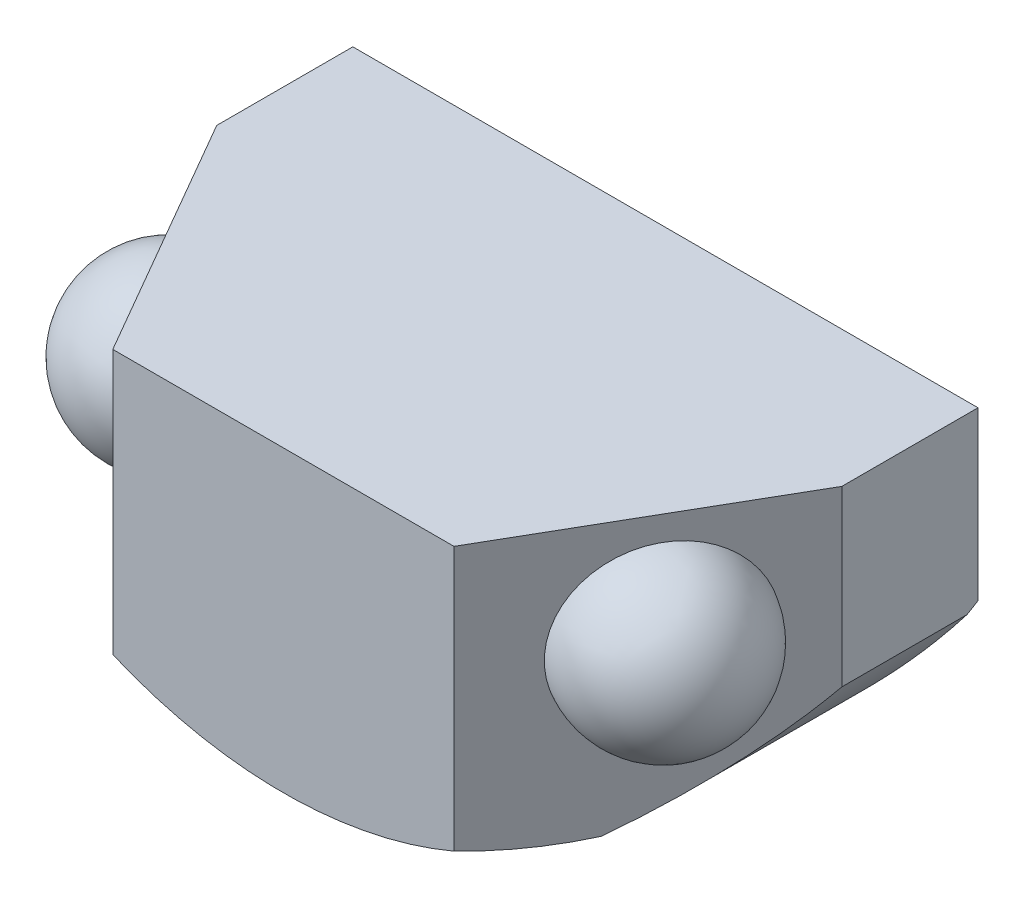
ISO-10303-21;
HEADER;
FILE_DESCRIPTION(('STEP AP214'),'2;1');
FILE_NAME('part.step','',(''),(''),'','','');
FILE_SCHEMA(('AUTOMOTIVE_DESIGN { 1 0 10303 214 1 1 1 1 }'));
ENDSEC;
DATA;
#1=APPLICATION_CONTEXT('core data for automotive mechanical design processes');
#2=APPLICATION_PROTOCOL_DEFINITION('international standard','automotive_design',2000,#1);
#3=PRODUCT_CONTEXT('',#1,'mechanical');
#4=PRODUCT('Part','Part','',(#3));
#5=PRODUCT_RELATED_PRODUCT_CATEGORY('part','',(#4));
#6=PRODUCT_DEFINITION_FORMATION('','',#4);
#7=PRODUCT_DEFINITION_CONTEXT('part definition',#1,'design');
#8=PRODUCT_DEFINITION('design','',#6,#7);
#9=PRODUCT_DEFINITION_SHAPE('','',#8);
#10=(LENGTH_UNIT() NAMED_UNIT(*) SI_UNIT(.MILLI.,.METRE.));
#11=(NAMED_UNIT(*) PLANE_ANGLE_UNIT() SI_UNIT($,.RADIAN.));
#12=(NAMED_UNIT(*) SI_UNIT($,.STERADIAN.) SOLID_ANGLE_UNIT());
#13=UNCERTAINTY_MEASURE_WITH_UNIT(LENGTH_MEASURE(1.E-05),#10,'distance_accuracy_value','');
#14=(GEOMETRIC_REPRESENTATION_CONTEXT(3) GLOBAL_UNCERTAINTY_ASSIGNED_CONTEXT((#13)) GLOBAL_UNIT_ASSIGNED_CONTEXT((#10,
#11,#12)) REPRESENTATION_CONTEXT('',''));
#15=CARTESIAN_POINT('',(0.,0.,0.));
#16=DIRECTION('',(0.,0.,1.));
#17=DIRECTION('',(1.,0.,0.));
#18=AXIS2_PLACEMENT_3D('',#15,#16,#17);
#19=CARTESIAN_POINT('',(-0.110419645241125,89.9999564553573,0.));
#20=DIRECTION('',(-1.,0.,0.));
#21=DIRECTION('',(0.,1.,0.));
#22=AXIS2_PLACEMENT_3D('',#19,#20,#21);
#23=SPHERICAL_SURFACE('',#22,137.5);
#24=CARTESIAN_POINT('',(-90.,89.9999564553573,0.));
#25=DIRECTION('',(1.,0.,0.));
#26=DIRECTION('',(0.,0.,-1.));
#27=AXIS2_PLACEMENT_3D('',#24,#25,#26);
#28=CIRCLE('',#27,104.048610483972);
#29=CARTESIAN_POINT('',(-90.,1.67604494977834,-55.));
#30=VERTEX_POINT('',#29);
#31=CARTESIAN_POINT('',(-90.,0.,-52.2122704129895));
#32=VERTEX_POINT('',#31);
#33=EDGE_CURVE('E136',#30,#32,#28,.F.);
#34=ORIENTED_EDGE('',*,*,#33,.F.);
#35=CARTESIAN_POINT('',(-0.110419645241125,89.9999564553573,-55.));
#36=DIRECTION('',(0.,0.,1.));
#37=DIRECTION('',(1.,0.,0.));
#38=AXIS2_PLACEMENT_3D('',#35,#36,#37);
#39=CIRCLE('',#38,126.020831611286);
#40=CARTESIAN_POINT('',(90.,1.90136241800312,-55.));
#41=VERTEX_POINT('',#40);
#42=EDGE_CURVE('E230',#41,#30,#39,.F.);
#43=ORIENTED_EDGE('',*,*,#42,.F.);
#44=CARTESIAN_POINT('',(90.,89.9999564553573,0.));
#45=DIRECTION('',(-1.,0.,0.));
#46=DIRECTION('',(0.,0.,1.));
#47=AXIS2_PLACEMENT_3D('',#44,#45,#46);
#48=CIRCLE('',#47,103.857413174788);
#49=CARTESIAN_POINT('',(89.9999999999999,0.,-51.8302046049629));
#50=VERTEX_POINT('',#49);
#51=EDGE_CURVE('E114',#50,#41,#48,.F.);
#52=ORIENTED_EDGE('',*,*,#51,.F.);
#53=CARTESIAN_POINT('',(90.0001244441362,0.000200000000027756,51.8303355371423));
#54=CARTESIAN_POINT('',(89.5643371455507,-0.700178610352941,51.3718230897122));
#55=CARTESIAN_POINT('',(89.1209950129852,-1.39446653913515,50.9112431579466));
#56=CARTESIAN_POINT('',(88.2196176610746,-2.77053290730016,49.985812461782));
#57=CARTESIAN_POINT('',(87.7615825901859,-3.45231147296736,49.5209617405685));
#58=CARTESIAN_POINT('',(86.3661085050789,-5.4783261612274,48.119845001896));
#59=CARTESIAN_POINT('',(85.4072451328863,-6.80333036203356,47.1769561764502));
#60=CARTESIAN_POINT('',(83.4354444766202,-9.40020378230806,45.2715730827207));
#61=CARTESIAN_POINT('',(82.4224621713083,-10.6720271424476,44.3090629164704));
#62=CARTESIAN_POINT('',(80.8662611778364,-12.5368772423552,42.8499369600321));
#63=CARTESIAN_POINT('',(80.3414035632126,-13.1513493935201,42.3609990602982));
#64=CARTESIAN_POINT('',(79.2799772964037,-14.3657275987914,41.3776632115938));
#65=CARTESIAN_POINT('',(78.7434079006048,-14.9656327228578,40.8832649169179));
#66=CARTESIAN_POINT('',(77.1258395645888,-16.7333616653512,39.3994887038453));
#67=CARTESIAN_POINT('',(76.0285411442321,-17.8792962955489,38.4016452998256));
#68=CARTESIAN_POINT('',(73.795832544943,-20.1095601196962,36.3802409435415));
#69=CARTESIAN_POINT('',(72.6604226830874,-21.1938898259799,35.3566802052561));
#70=CARTESIAN_POINT('',(70.3587431820081,-23.2973821302197,33.2801090758536));
#71=CARTESIAN_POINT('',(69.1924974784448,-24.3165932904109,32.2271214925139));
#72=CARTESIAN_POINT('',(67.425770121288,-25.7945945362514,30.6204424481673));
#73=CARTESIAN_POINT('',(66.8340001076856,-26.2787677369068,30.0803795487446));
#74=CARTESIAN_POINT('',(65.6459073343606,-27.2297641403249,28.9900701648321));
#75=CARTESIAN_POINT('',(65.0495846227699,-27.6965875262075,28.4398237879166));
#76=CARTESIAN_POINT('',(63.7462840446876,-28.6947499299435,27.2278883856204));
#77=CARTESIAN_POINT('',(63.038699971346,-29.2225857774781,26.5639600575375));
#78=CARTESIAN_POINT('',(61.6222421511666,-30.2523380718784,25.2177281136735));
#79=CARTESIAN_POINT('',(60.9133684974253,-30.7542563184587,24.5354257788002));
#80=CARTESIAN_POINT('',(59.4958499101807,-31.732477069737,23.147019187393));
#81=CARTESIAN_POINT('',(58.7872124973898,-32.2086953459053,22.4408477043511));
#82=CARTESIAN_POINT('',(57.3774265274438,-33.132153418792,21.0025764090854));
#83=CARTESIAN_POINT('',(56.6762774853064,-33.5793951017937,20.2704782894107));
#84=CARTESIAN_POINT('',(55.2828275915951,-34.4460442770492,18.7690500720258));
#85=CARTESIAN_POINT('',(54.5906378104413,-34.8652085147239,17.9994748943805));
#86=CARTESIAN_POINT('',(53.2303358814403,-35.6687270494109,16.4208304088638));
#87=CARTESIAN_POINT('',(52.5622362009678,-36.0530634733196,15.6117411470586));
#88=CARTESIAN_POINT('',(51.2672518893754,-36.7804762913613,13.9479375177054));
#89=CARTESIAN_POINT('',(50.640227638782,-37.1236961389575,13.0933977504839));
#90=CARTESIAN_POINT('',(49.7461406001163,-37.6025462900454,11.7679250196526));
#91=CARTESIAN_POINT('',(49.4559712358348,-37.7561064245375,11.3190317887242));
#92=CARTESIAN_POINT('',(48.8949655120424,-38.0498925238791,10.4051581079762));
#93=CARTESIAN_POINT('',(48.6241241452361,-38.1901219454598,9.9401818714591));
#94=CARTESIAN_POINT('',(48.1323973181046,-38.4422623005999,9.04030020414074));
#95=CARTESIAN_POINT('',(47.9092260379225,-38.5556028608424,8.60705737083245));
#96=CARTESIAN_POINT('',(47.4865000908309,-38.7686043510765,7.72602625182977));
#97=CARTESIAN_POINT('',(47.2869458045778,-38.8682650605818,7.27823773183771));
#98=CARTESIAN_POINT('',(46.7314483084643,-39.1437972326752,5.9139244899931));
#99=CARTESIAN_POINT('',(46.4174844045664,-39.2968203601745,4.97436864754291));
#100=CARTESIAN_POINT('',(45.9804192402713,-39.5083900742484,3.19258080251376));
#101=CARTESIAN_POINT('',(45.8356619768001,-39.5777107416758,2.35706491631263));
#102=CARTESIAN_POINT('',(45.677848982549,-39.6532420632213,0.670681118657874));
#103=CARTESIAN_POINT('',(45.6647089317822,-39.6594931226244,-0.180176613996959));
#104=CARTESIAN_POINT('',(45.7719734967884,-39.6082069943576,-1.87007872066989));
#105=CARTESIAN_POINT('',(45.8922334084327,-39.5507389253349,-2.70913489736391));
#106=CARTESIAN_POINT('',(46.2489589681337,-39.3785691041607,-4.35582446157462));
#107=CARTESIAN_POINT('',(46.4855269500442,-39.2638169491404,-5.16342950020558));
#108=CARTESIAN_POINT('',(46.9970603177986,-39.012322917215,-6.5912525034693));
#109=CARTESIAN_POINT('',(47.2568699345828,-38.8835538636362,-7.21853591003946));
#110=CARTESIAN_POINT('',(47.8237014513651,-38.5991233002087,-8.44533755796082));
#111=CARTESIAN_POINT('',(48.1307569023889,-38.4434426696711,-9.04483567116382));
#112=CARTESIAN_POINT('',(48.7821371892332,-38.1086481711404,-10.2193076686139));
#113=CARTESIAN_POINT('',(49.1266008427314,-37.9294464680038,-10.7941783471244));
#114=CARTESIAN_POINT('',(49.8429859143022,-37.5512749329174,-11.9193610561673));
#115=CARTESIAN_POINT('',(50.2149001260322,-37.352310284443,-12.4696794717415));
#116=CARTESIAN_POINT('',(51.1625991755198,-36.837499685889,-13.8071620348821));
#117=CARTESIAN_POINT('',(51.7507317469119,-36.5113056296251,-14.5815593519037));
#118=CARTESIAN_POINT('',(52.9569778147217,-35.8261446064475,-16.09179711075));
#119=CARTESIAN_POINT('',(53.5751074833687,-35.4671598671027,-16.8276162992383));
#120=CARTESIAN_POINT('',(54.8318125068668,-34.7193920532727,-18.2685762653042));
#121=CARTESIAN_POINT('',(55.4704245429064,-34.3305535544394,-18.9736559757949));
#122=CARTESIAN_POINT('',(56.7593760194481,-33.5262557848294,-20.3569788055743));
#123=CARTESIAN_POINT('',(57.4097131728228,-33.1108016662356,-21.0352270779526));
#124=CARTESIAN_POINT('',(58.7215745668974,-32.2518890038446,-22.3741653990402));
#125=CARTESIAN_POINT('',(59.3831456960689,-31.8082496946928,-23.0346930349095));
#126=CARTESIAN_POINT('',(60.7087325864702,-30.8970472216399,-24.3365124925444));
#127=CARTESIAN_POINT('',(61.3727484230845,-30.4294833141737,-24.9778037154676));
#128=CARTESIAN_POINT('',(62.6993637677329,-29.4719738557513,-26.243235385654));
#129=CARTESIAN_POINT('',(63.3619640272427,-28.9820509468545,-26.8673922013515));
#130=CARTESIAN_POINT('',(64.6839094101512,-27.9802356608434,-28.1013844400579));
#131=CARTESIAN_POINT('',(65.3432543938911,-27.4683423501255,-28.7112192527647));
#132=CARTESIAN_POINT('',(67.1419632419827,-26.0370975087309,-30.3644616243266));
#133=CARTESIAN_POINT('',(68.2759327390024,-25.0962226432387,-31.3951921628885));
#134=CARTESIAN_POINT('',(70.5191280089368,-23.1533674099443,-33.425668162579));
#135=CARTESIAN_POINT('',(71.6283513804514,-22.1513811467278,-34.4254106202128));
#136=CARTESIAN_POINT('',(73.816233265414,-20.0882791176858,-36.3994182606151));
#137=CARTESIAN_POINT('',(74.8948684013443,-19.0271198725165,-37.3736639154216));
#138=CARTESIAN_POINT('',(77.0152957211372,-16.848848548111,-39.2994191075076));
#139=CARTESIAN_POINT('',(78.0570879346813,-15.7317365139531,-40.2509286631037));
#140=CARTESIAN_POINT('',(80.0774562355747,-13.4683591186317,-42.1136901339994));
#141=CARTESIAN_POINT('',(81.0569069454593,-12.3232246910942,-43.0253678337385));
#142=CARTESIAN_POINT('',(82.9723809015412,-9.98385899570126,-44.8311906195868));
#143=CARTESIAN_POINT('',(83.9084041968393,-8.78962778335959,-45.7253357255184));
#144=CARTESIAN_POINT('',(85.7329372372583,-6.35523164362213,-47.4967506659377));
#145=CARTESIAN_POINT('',(86.6214830997474,-5.11510288336522,-48.3740329934772));
#146=CARTESIAN_POINT('',(88.3488527003866,-2.59029210823437,-50.1133751139867));
#147=CARTESIAN_POINT('',(89.187675360651,-1.30560912848264,-50.9754345766755));
#148=CARTESIAN_POINT('',(90.0001244441362,0.000200000000022882,-51.8303355371423));
#149=B_SPLINE_CURVE_WITH_KNOTS('',3,(#53,#54,#55,#56,#57,#58,#59,#60,#61,#62,#63,#64,#65,#66,
#67,#68,#69,#70,#71,#72,#73,#74,#75,#76,#77,#78,#79,#80,#81,#82,#83,#84,#85,#86,#87,#88,#89,#90,
#91,#92,#93,#94,#95,#96,#97,#98,#99,#100,#101,#102,#103,#104,#105,#106,#107,#108,#109,#110,#111,
#112,#113,#114,#115,#116,#117,#118,#119,#120,#121,#122,#123,#124,#125,#126,#127,#128,#129,#130,
#131,#132,#133,#134,#135,#136,#137,#138,#139,#140,#141,#142,#143,#144,#145,#146,#147,#148),
.UNSPECIFIED.,.F.,.F.,(4,2,2,2,2,2,2,2,2,2,2,2,2,2,2,2,2,2,2,2,2,2,2,2,2,2,2,2,2,2,2,2,2,2,2,2,
2,2,2,2,2,2,2,2,2,2,2,4),(0.,2.83116123108852,5.66229386532291,11.3241993444443,
16.9908905839125,19.8242643091421,22.657818459564,28.2789397297367,33.9000142452987,
39.5168466932012,42.3249613881043,45.1330464361406,48.4463400706982,51.7594033203657,
55.0827366388699,58.4058534011994,61.7547890266959,65.1054336556731,68.4440248114548,
70.1118456283679,71.7792327832148,73.2793547200334,74.779500832372,77.7724328596681,
80.3136055360611,82.8531501171807,85.3899426469948,87.9289711832449,89.9991730301529,
92.0708518479042,94.1504996184289,96.2296033667748,99.3042420254029,102.380557128708,
105.462728423153,108.544304871179,111.648162567152,114.752116788221,117.852994635762,
120.954004381803,126.346949881976,131.740416464835,137.137899682296,142.535378551344,
147.817670042325,153.099955560782,158.378163755363,163.65648632766),.UNSPECIFIED.);
#150=CARTESIAN_POINT('',(64.6616836771224,-27.9932536817081,28.0789421586245));
#151=VERTEX_POINT('',#150);
#152=EDGE_CURVE('E109',#151,#50,#149,.T.);
#153=ORIENTED_EDGE('',*,*,#152,.F.);
#154=CARTESIAN_POINT('',(60.6271964569131,89.9999564553573,35.0668790065144));
#155=DIRECTION('',(0.866025403784442,0.,0.499999999999995));
#156=DIRECTION('',(0.499999999999995,0.,-0.866025403784442));
#157=AXIS2_PLACEMENT_3D('',#154,#155,#156);
#158=CIRCLE('',#157,118.268787036013);
#159=CARTESIAN_POINT('',(49.1188036855349,-26.007515589544,55.));
#160=VERTEX_POINT('',#159);
#161=EDGE_CURVE('E112',#151,#160,#158,.F.);
#162=ORIENTED_EDGE('',*,*,#161,.T.);
#163=CARTESIAN_POINT('',(-0.110419645241125,89.9999564553573,55.));
#164=DIRECTION('',(0.,0.,-1.));
#165=DIRECTION('',(-1.,0.,0.));
#166=AXIS2_PLACEMENT_3D('',#163,#164,#165);
#167=CIRCLE('',#166,126.020831611286);
#168=CARTESIAN_POINT('',(-49.1188036855349,-26.1009836517713,55.));
#169=VERTEX_POINT('',#168);
#170=EDGE_CURVE('E119',#169,#160,#167,.F.);
#171=ORIENTED_EDGE('',*,*,#170,.F.);
#172=CARTESIAN_POINT('',(-60.6824062795336,89.9999564553573,34.9712527886587));
#173=DIRECTION('',(0.866025403784442,0.,-0.499999999999995));
#174=DIRECTION('',(-0.499999999999995,0.,-0.866025403784442));
#175=AXIS2_PLACEMENT_3D('',#172,#173,#174);
#176=CIRCLE('',#175,118.381991508704);
#177=CARTESIAN_POINT('',(-64.4716484701931,-28.1392093113304,28.4080927922529));
#178=VERTEX_POINT('',#177);
#179=EDGE_CURVE('E239',#178,#169,#176,.F.);
#180=ORIENTED_EDGE('',*,*,#179,.F.);
#181=CARTESIAN_POINT('',(-90.0001244441362,0.000200000000013538,-52.2124009134216));
#182=CARTESIAN_POINT('',(-89.5624140176202,-0.703269330484123,-51.753383766432));
#183=CARTESIAN_POINT('',(-89.1170753476434,-1.40060481363441,-51.2922968600302));
#184=CARTESIAN_POINT('',(-88.2115598162281,-2.78267776574401,-50.3658515587344));
#185=CARTESIAN_POINT('',(-87.7513831066432,-3.46741536351835,-49.9004932075895));
#186=CARTESIAN_POINT('',(-86.3492711699605,-5.50216802415227,-48.4978604056645));
#187=CARTESIAN_POINT('',(-85.385696435819,-6.83281559561238,-47.5539678488508));
#188=CARTESIAN_POINT('',(-83.4039576354995,-9.44053580666943,-45.6466780803139));
#189=CARTESIAN_POINT('',(-82.385750784616,-10.7175650182419,-44.6832659605861));
#190=CARTESIAN_POINT('',(-80.8212975207098,-12.5899379752821,-43.2228684136606));
#191=CARTESIAN_POINT('',(-80.2936196019101,-13.2068704200765,-42.7335199410671));
#192=CARTESIAN_POINT('',(-79.2264126385471,-14.4260745249208,-41.7493982386888));
#193=CARTESIAN_POINT('',(-78.6868828400693,-15.0283452471508,-41.2546246648143));
#194=CARTESIAN_POINT('',(-77.0601925129258,-16.8030764111793,-39.7697241065913));
#195=CARTESIAN_POINT('',(-75.9565210539981,-17.9535054357297,-38.7711947428604));
#196=CARTESIAN_POINT('',(-73.7104716255493,-20.1923946160494,-36.7486802874164));
#197=CARTESIAN_POINT('',(-72.5680939460665,-21.2808552360042,-35.7246953864653));
#198=CARTESIAN_POINT('',(-70.2518026438909,-23.3922986261447,-33.6476472784412));
#199=CARTESIAN_POINT('',(-69.0779128562023,-24.4153290094285,-32.5946060329646));
#200=CARTESIAN_POINT('',(-67.2991251066776,-25.8988674631186,-30.9882782353689));
#201=CARTESIAN_POINT('',(-66.7032353030991,-26.3848550182778,-30.4484035738841));
#202=CARTESIAN_POINT('',(-65.5066775893651,-27.339430869385,-29.3586473964299));
#203=CARTESIAN_POINT('',(-64.9060097254966,-27.8080193336369,-28.8087659773341));
#204=CARTESIAN_POINT('',(-63.5875030489239,-28.8141548596355,-27.5928354825306));
#205=CARTESIAN_POINT('',(-62.868971019077,-29.3480009444807,-26.9244693920728));
#206=CARTESIAN_POINT('',(-61.4301733681519,-30.3893645431117,-25.5694497843268));
#207=CARTESIAN_POINT('',(-60.7099078792312,-30.8968840013903,-24.882797623339));
#208=CARTESIAN_POINT('',(-59.2692120879452,-31.885869087775,-23.4859041360025));
#209=CARTESIAN_POINT('',(-58.548787505391,-32.3672538830793,-22.7755994951969));
#210=CARTESIAN_POINT('',(-57.1148927247112,-33.3007316291497,-21.3292093253033));
#211=CARTESIAN_POINT('',(-56.4014220976733,-33.7528263963303,-20.5931253992816));
#212=CARTESIAN_POINT('',(-54.9828900099538,-34.6288108260241,-19.0841720186509));
#213=CARTESIAN_POINT('',(-54.2779293521167,-35.0524679246175,-18.3110713354176));
#214=CARTESIAN_POINT('',(-52.8912944209354,-35.8648835656794,-16.7256163398187));
#215=CARTESIAN_POINT('',(-52.2096317717343,-36.2536248405186,-15.9132429072708));
#216=CARTESIAN_POINT('',(-50.8863832534329,-36.990030121971,-14.2429101765111));
#217=CARTESIAN_POINT('',(-50.2446699247942,-37.3378282983875,-13.3851139336097));
#218=CARTESIAN_POINT('',(-49.3275352159446,-37.8238501812544,-12.0547176764646));
#219=CARTESIAN_POINT('',(-49.0295132082332,-37.9798528487104,-11.6041693519534));
#220=CARTESIAN_POINT('',(-48.452426747615,-38.2786698870207,-10.6869153570691));
#221=CARTESIAN_POINT('',(-48.173357588954,-38.4214875347378,-10.2202137411198));
#222=CARTESIAN_POINT('',(-47.6652532958426,-38.6789131158255,-9.31625597194655));
#223=CARTESIAN_POINT('',(-47.4339997447078,-38.7949140576137,-8.88065638277966));
#224=CARTESIAN_POINT('',(-46.9948682369359,-39.0133810502649,-7.99462756904302));
#225=CARTESIAN_POINT('',(-46.7869907856767,-39.1158468085134,-7.54419802413026));
#226=CARTESIAN_POINT('',(-46.2062448758477,-39.4000418373118,-6.17129414408214));
#227=CARTESIAN_POINT('',(-45.8750671139624,-39.5591681387787,-5.22516197373359));
#228=CARTESIAN_POINT('',(-45.4087046023636,-39.7815600553324,-3.43505792602775));
#229=CARTESIAN_POINT('',(-45.2508404497527,-39.8559892649558,-2.59852101159753));
#230=CARTESIAN_POINT('',(-45.0671566840728,-39.9424971525947,-0.907738676255292));
#231=CARTESIAN_POINT('',(-45.0412341089224,-39.9546244486723,-0.0535075860716561));
#232=CARTESIAN_POINT('',(-45.1252897666976,-39.9151177531663,1.64604516232995));
#233=CARTESIAN_POINT('',(-45.235218469892,-39.8635069997085,2.49136995437973));
#234=CARTESIAN_POINT('',(-45.5748589316549,-39.7024864315881,4.15168690478056));
#235=CARTESIAN_POINT('',(-45.8046790699859,-39.5930243191336,4.96665090213518));
#236=CARTESIAN_POINT('',(-46.3012128757606,-39.3533264425194,6.39115911118408));
#237=CARTESIAN_POINT('',(-46.5506360611503,-39.2319840284568,7.00849750361389));
#238=CARTESIAN_POINT('',(-47.0963421921211,-38.9632931584815,8.21649409617677));
#239=CARTESIAN_POINT('',(-47.3926568123652,-38.8159271160301,8.80713391247434));
#240=CARTESIAN_POINT('',(-48.0224971101665,-38.4984896706543,9.96460553219159));
#241=CARTESIAN_POINT('',(-48.3561579856697,-38.3283353039821,10.531339892191));
#242=CARTESIAN_POINT('',(-49.0511443881337,-37.9688166769946,11.6408481200176));
#243=CARTESIAN_POINT('',(-49.4124631165835,-37.7794571337629,12.1836278246947));
#244=CARTESIAN_POINT('',(-50.3276346034371,-37.2925878094541,13.4934301577986));
#245=CARTESIAN_POINT('',(-50.8934595808481,-36.9854627746518,14.2484803200684));
#246=CARTESIAN_POINT('',(-52.0552895196212,-36.3400752919794,15.721378436693));
#247=CARTESIAN_POINT('',(-52.6513106534403,-36.0017960775192,16.4392060299163));
#248=CARTESIAN_POINT('',(-53.8642066712637,-35.2969888910323,17.8449866625414));
#249=CARTESIAN_POINT('',(-54.4811160880647,-34.9304127156876,18.5328854576436));
#250=CARTESIAN_POINT('',(-55.7276075200202,-34.1718712044824,19.8827472745893));
#251=CARTESIAN_POINT('',(-56.3571909717596,-33.7799029791715,20.5447073309691));
#252=CARTESIAN_POINT('',(-57.6284925868237,-32.969261991775,21.851670228782));
#253=CARTESIAN_POINT('',(-58.2702665198502,-32.5504096324965,22.4965068932051));
#254=CARTESIAN_POINT('',(-59.557244395524,-31.6899877556693,23.767319305453));
#255=CARTESIAN_POINT('',(-60.202448437864,-31.2484175745768,24.3932945015229));
#256=CARTESIAN_POINT('',(-61.4925196250659,-30.3440210532842,25.6284179646806));
#257=CARTESIAN_POINT('',(-62.137386480528,-29.8812159659459,26.2375821193798));
#258=CARTESIAN_POINT('',(-63.4249707891053,-28.9347506090078,27.4418327081434));
#259=CARTESIAN_POINT('',(-64.0676881590773,-28.4510895425174,28.0369186029407));
#260=CARTESIAN_POINT('',(-65.9137462434715,-27.0282628035832,29.7340190867606));
#261=CARTESIAN_POINT('',(-67.1117838980795,-26.063446236672,30.8204143639204));
#262=CARTESIAN_POINT('',(-69.482568585262,-24.0660787427461,32.958161317529));
#263=CARTESIAN_POINT('',(-70.6553125400903,-23.0335196338929,34.0095087377404));
#264=CARTESIAN_POINT('',(-72.968577663827,-20.9029359007166,36.0837711022589));
#265=CARTESIAN_POINT('',(-74.1090706908623,-19.804856553274,37.1066612030919));
#266=CARTESIAN_POINT('',(-76.3504787296994,-17.5468223400419,39.1272913318909));
#267=CARTESIAN_POINT('',(-77.4513937340013,-16.3868674625275,40.1250313550909));
#268=CARTESIAN_POINT('',(-79.0561518110617,-14.6168488899937,41.5931676747234));
#269=CARTESIAN_POINT('',(-79.5771502111526,-14.0292526481309,42.0720615858429));
#270=CARTESIAN_POINT('',(-80.6078712104242,-12.8403225372818,43.0247969342326));
#271=CARTESIAN_POINT('',(-81.117594514388,-12.2389895317556,43.4986386863384));
#272=CARTESIAN_POINT('',(-82.6291205648981,-10.4147755813654,44.9130139636508));
#273=CARTESIAN_POINT('',(-83.6133002548087,-9.17165677752101,45.8464164850638));
#274=CARTESIAN_POINT('',(-85.5298454429008,-6.63521418533481,47.6947925615549));
#275=CARTESIAN_POINT('',(-86.4622565287402,-5.34193632864198,48.6097818636522));
#276=CARTESIAN_POINT('',(-87.8200918508669,-3.36556723287495,49.9698609574579));
#277=CARTESIAN_POINT('',(-88.2659218626821,-2.70067786761452,50.4211690001602));
#278=CARTESIAN_POINT('',(-89.1436030422652,-1.35905017360555,51.3197680058768));
#279=CARTESIAN_POINT('',(-89.5754540559329,-0.682311714362847,51.7670589245683));
#280=CARTESIAN_POINT('',(-90.0001244441362,0.000200000000058823,52.2124009134216));
#281=B_SPLINE_CURVE_WITH_KNOTS('',3,(#181,#182,#183,#184,#185,#186,#187,#188,#189,#190,#191,
#192,#193,#194,#195,#196,#197,#198,#199,#200,#201,#202,#203,#204,#205,#206,#207,#208,#209,#210,
#211,#212,#213,#214,#215,#216,#217,#218,#219,#220,#221,#222,#223,#224,#225,#226,#227,#228,#229,
#230,#231,#232,#233,#234,#235,#236,#237,#238,#239,#240,#241,#242,#243,#244,#245,#246,#247,#248,
#249,#250,#251,#252,#253,#254,#255,#256,#257,#258,#259,#260,#261,#262,#263,#264,#265,#266,#267,
#268,#269,#270,#271,#272,#273,#274,#275,#276,#277,#278,#279,#280),.UNSPECIFIED.,.F.,.F.,(4,2,2,
2,2,2,2,2,2,2,2,2,2,2,2,2,2,2,2,2,2,2,2,2,2,2,2,2,2,2,2,2,2,2,2,2,2,2,2,2,2,2,2,2,2,2,2,2,2,4),
(0.,2.84144334045694,5.68285761061784,11.3653122986075,17.0522840229015,19.8958011138669,
22.7394996116936,28.3811471081061,34.0227523391735,39.6602043758687,42.4786356962904,
45.2970397464991,48.6480101887032,51.9987327737558,55.3592889128861,58.7196364480059,
62.1047628417462,65.4915542372105,68.8669185559852,70.5531680867627,72.2389974006717,
73.757995972935,75.2770273787577,78.307817951505,80.8604057617729,83.4110013259447,
85.9606672481374,88.5126420279933,90.5401179941695,92.5689693910164,94.6054187410434,
96.6413691138917,99.6158658382601,102.591972840957,105.573266477202,108.554899963288,
111.559090857295,114.563369547805,117.564704351873,120.56615393639,126.213769172352,
131.862067778688,137.51515178777,143.168236868079,145.927504984404,148.686600134378,
154.204681583289,159.71782409476,162.474591336988,165.231388958632),.UNSPECIFIED.);
#282=EDGE_CURVE('E223',#32,#178,#281,.T.);
#283=ORIENTED_EDGE('',*,*,#282,.F.);
#284=EDGE_LOOP('',(#34,#43,#52,#153,#162,#171,#180,#283));
#285=FACE_BOUND('',#284,.T.);
#286=ADVANCED_FACE('F45',(#285),#23,.T.);
#287=CARTESIAN_POINT('',(71.1373818974067,17.9425764885766,16.8627038266085));
#288=DIRECTION('',(0.,1.,0.));
#289=DIRECTION('',(0.499999999999995,0.,-0.866025403784442));
#290=AXIS2_PLACEMENT_3D('',#287,#288,#289);
#291=SPHERICAL_SURFACE('',#290,25.);
#292=CARTESIAN_POINT('',(71.1373818974067,17.9425764885766,16.8627038266085));
#293=DIRECTION('',(0.866025403784442,0.,0.499999999999995));
#294=DIRECTION('',(0.499999999999995,0.,-0.866025403784442));
#295=AXIS2_PLACEMENT_3D('',#292,#293,#294);
#296=SPHERICAL_SURFACE('',#295,25.);
#297=CARTESIAN_POINT('',(71.1373818974067,17.9425764885766,16.8627038266085));
#298=DIRECTION('',(0.866025403784442,0.,0.499999999999995));
#299=DIRECTION('',(0.499999999999995,0.,-0.866025403784442));
#300=AXIS2_PLACEMENT_3D('',#297,#298,#299);
#301=CIRCLE('',#300,25.);
#302=CARTESIAN_POINT('',(83.6373818974066,17.9425764885766,-4.78793126800255));
#303=VERTEX_POINT('',#302);
#304=EDGE_CURVE('E130',#303,#303,#301,.T.);
#305=ORIENTED_EDGE('',*,*,#304,.T.);
#306=EDGE_LOOP('',(#305));
#307=FACE_BOUND('',#306,.T.);
#308=ADVANCED_FACE('F187',(#307),#296,.T.);
#309=CARTESIAN_POINT('',(-71.1373818974067,17.9425764885766,16.8627038266085));
#310=DIRECTION('',(0.,1.,0.));
#311=DIRECTION('',(-0.499999999999995,0.,-0.866025403784442));
#312=AXIS2_PLACEMENT_3D('',#309,#310,#311);
#313=SPHERICAL_SURFACE('',#312,25.);
#314=CARTESIAN_POINT('',(-71.1373818974067,17.9425764885766,16.8627038266085));
#315=DIRECTION('',(0.866025403784442,0.,-0.499999999999995));
#316=DIRECTION('',(-0.499999999999995,0.,-0.866025403784442));
#317=AXIS2_PLACEMENT_3D('',#314,#315,#316);
#318=SPHERICAL_SURFACE('',#317,25.);
#319=CARTESIAN_POINT('',(-71.1373818974067,17.9425764885766,16.8627038266085));
#320=DIRECTION('',(0.866025403784442,0.,-0.499999999999995));
#321=DIRECTION('',(-0.499999999999995,0.,-0.866025403784442));
#322=AXIS2_PLACEMENT_3D('',#319,#320,#321);
#323=CIRCLE('',#322,25.);
#324=CARTESIAN_POINT('',(-83.6373818974066,17.9425764885766,-4.78793126800255));
#325=VERTEX_POINT('',#324);
#326=EDGE_CURVE('E11',#325,#325,#323,.T.);
#327=ORIENTED_EDGE('',*,*,#326,.F.);
#328=EDGE_LOOP('',(#327));
#329=FACE_BOUND('',#328,.T.);
#330=ADVANCED_FACE('F181',(#329),#318,.T.);
#331=CARTESIAN_POINT('',(0.,0.,-65.));
#332=DIRECTION('',(0.,0.,-1.));
#333=DIRECTION('',(-1.,0.,0.));
#334=AXIS2_PLACEMENT_3D('',#331,#332,#333);
#335=PLANE('',#334);
#336=CARTESIAN_POINT('',(0.,0.,-65.));
#337=DIRECTION('',(0.,0.,-1.));
#338=DIRECTION('',(-1.,0.,0.));
#339=AXIS2_PLACEMENT_3D('',#336,#337,#338);
#340=CIRCLE('',#339,5.);
#341=CARTESIAN_POINT('',(-5.,0.,-65.));
#342=VERTEX_POINT('',#341);
#343=EDGE_CURVE('E53',#342,#342,#340,.T.);
#344=ORIENTED_EDGE('',*,*,#343,.T.);
#345=EDGE_LOOP('',(#344));
#346=FACE_BOUND('',#345,.T.);
#347=ADVANCED_FACE('F174',(#346),#335,.T.);
#348=CARTESIAN_POINT('',(0.,0.,-45.));
#349=DIRECTION('',(0.,0.,-1.));
#350=DIRECTION('',(-1.,0.,0.));
#351=AXIS2_PLACEMENT_3D('',#348,#349,#350);
#352=CYLINDRICAL_SURFACE('',#351,5.);
#353=CARTESIAN_POINT('',(0.,0.,-55.));
#354=DIRECTION('',(0.,0.,1.));
#355=DIRECTION('',(1.,0.,0.));
#356=AXIS2_PLACEMENT_3D('',#353,#354,#355);
#357=CIRCLE('',#356,5.);
#358=CARTESIAN_POINT('',(5.,0.,-55.));
#359=VERTEX_POINT('',#358);
#360=EDGE_CURVE('E169',#359,#359,#357,.T.);
#361=ORIENTED_EDGE('',*,*,#360,.F.);
#362=EDGE_LOOP('',(#361));
#363=FACE_BOUND('',#362,.T.);
#364=ORIENTED_EDGE('',*,*,#343,.F.);
#365=EDGE_LOOP('',(#364));
#366=FACE_BOUND('',#365,.T.);
#367=ADVANCED_FACE('F176',(#363,#366),#352,.T.);
#368=CARTESIAN_POINT('',(0.,50.,0.));
#369=DIRECTION('',(0.,-1.,0.));
#370=DIRECTION('',(0.,0.,-1.));
#371=AXIS2_PLACEMENT_3D('',#368,#369,#370);
#372=PLANE('',#371);
#373=DIRECTION('',(0.499999999999995,0.,-0.866025403784442));
#374=VECTOR('',#373,1.);
#375=CARTESIAN_POINT('',(49.1188036855349,50.,55.));
#376=LINE('',#375,#374);
#377=CARTESIAN_POINT('',(49.1188036855349,50.,55.));
#378=VERTEX_POINT('',#377);
#379=CARTESIAN_POINT('',(90.,50.,-15.808309090852));
#380=VERTEX_POINT('',#379);
#381=EDGE_CURVE('E60',#378,#380,#376,.T.);
#382=ORIENTED_EDGE('',*,*,#381,.T.);
#383=DIRECTION('',(0.,0.,-1.));
#384=VECTOR('',#383,1.);
#385=CARTESIAN_POINT('',(90.,50.,55.));
#386=LINE('',#385,#384);
#387=CARTESIAN_POINT('',(90.,50.,-55.));
#388=VERTEX_POINT('',#387);
#389=EDGE_CURVE('E151',#380,#388,#386,.T.);
#390=ORIENTED_EDGE('',*,*,#389,.T.);
#391=DIRECTION('',(-1.,0.,0.));
#392=VECTOR('',#391,1.);
#393=CARTESIAN_POINT('',(-90.,50.,-55.));
#394=LINE('',#393,#392);
#395=CARTESIAN_POINT('',(-90.,50.,-55.));
#396=VERTEX_POINT('',#395);
#397=EDGE_CURVE('E149',#388,#396,#394,.T.);
#398=ORIENTED_EDGE('',*,*,#397,.T.);
#399=DIRECTION('',(0.,0.,1.));
#400=VECTOR('',#399,1.);
#401=CARTESIAN_POINT('',(-90.,50.,55.));
#402=LINE('',#401,#400);
#403=CARTESIAN_POINT('',(-90.,50.,-15.808309090852));
#404=VERTEX_POINT('',#403);
#405=EDGE_CURVE('E146',#396,#404,#402,.T.);
#406=ORIENTED_EDGE('',*,*,#405,.T.);
#407=DIRECTION('',(-0.499999999999995,0.,-0.866025403784442));
#408=VECTOR('',#407,1.);
#409=CARTESIAN_POINT('',(-49.1188036855349,50.,55.));
#410=LINE('',#409,#408);
#411=CARTESIAN_POINT('',(-49.1188036855349,50.,55.));
#412=VERTEX_POINT('',#411);
#413=EDGE_CURVE('E163',#412,#404,#410,.T.);
#414=ORIENTED_EDGE('',*,*,#413,.F.);
#415=DIRECTION('',(1.,0.,0.));
#416=VECTOR('',#415,1.);
#417=CARTESIAN_POINT('',(-90.,50.,55.));
#418=LINE('',#417,#416);
#419=EDGE_CURVE('E144',#412,#378,#418,.T.);
#420=ORIENTED_EDGE('',*,*,#419,.T.);
#421=EDGE_LOOP('',(#382,#390,#398,#406,#414,#420));
#422=FACE_BOUND('',#421,.T.);
#423=ADVANCED_FACE('F178',(#422),#372,.F.);
#424=CARTESIAN_POINT('',(49.1188036855349,-50.,55.));
#425=DIRECTION('',(0.866025403784442,0.,0.499999999999995));
#426=DIRECTION('',(0.499999999999995,0.,-0.866025403784442));
#427=AXIS2_PLACEMENT_3D('',#424,#425,#426);
#428=PLANE('',#427);
#429=ORIENTED_EDGE('',*,*,#161,.F.);
#430=CARTESIAN_POINT('',(0.,56.,140.076263590349));
#431=DIRECTION('',(0.866025403784442,0.,0.499999999999995));
#432=DIRECTION('',(0.499999999999995,0.,-0.866025403784442));
#433=AXIS2_PLACEMENT_3D('',#430,#431,#432);
#434=ELLIPSE('',#433,212.000000000002,106.);
#435=CARTESIAN_POINT('',(90.,0.,-15.808309090852));
#436=VERTEX_POINT('',#435);
#437=EDGE_CURVE('E124',#151,#436,#434,.T.);
#438=ORIENTED_EDGE('',*,*,#437,.T.);
#439=DIRECTION('',(0.,1.,0.));
#440=VECTOR('',#439,1.);
#441=CARTESIAN_POINT('',(90.,-50.,-15.808309090852));
#442=LINE('',#441,#440);
#443=EDGE_CURVE('E166',#436,#380,#442,.T.);
#444=ORIENTED_EDGE('',*,*,#443,.T.);
#445=ORIENTED_EDGE('',*,*,#381,.F.);
#446=DIRECTION('',(0.,1.,0.));
#447=VECTOR('',#446,1.);
#448=CARTESIAN_POINT('',(49.1188036855349,-50.,55.));
#449=LINE('',#448,#447);
#450=EDGE_CURVE('E125',#160,#378,#449,.T.);
#451=ORIENTED_EDGE('',*,*,#450,.F.);
#452=EDGE_LOOP('',(#429,#438,#444,#445,#451));
#453=FACE_BOUND('',#452,.T.);
#454=ORIENTED_EDGE('',*,*,#304,.F.);
#455=EDGE_LOOP('',(#454));
#456=FACE_BOUND('',#455,.T.);
#457=ADVANCED_FACE('F122',(#453,#456),#428,.T.);
#458=CARTESIAN_POINT('',(-49.1188036855349,-50.,55.));
#459=DIRECTION('',(0.866025403784442,0.,-0.499999999999995));
#460=DIRECTION('',(-0.499999999999995,0.,-0.866025403784442));
#461=AXIS2_PLACEMENT_3D('',#458,#459,#460);
#462=PLANE('',#461);
#463=CARTESIAN_POINT('',(0.,56.,140.076263590349));
#464=DIRECTION('',(0.866025403784442,0.,-0.499999999999995));
#465=DIRECTION('',(-0.499999999999995,0.,-0.866025403784442));
#466=AXIS2_PLACEMENT_3D('',#463,#464,#465);
#467=ELLIPSE('',#466,212.000000000002,106.);
#468=CARTESIAN_POINT('',(-90.,0.,-15.808309090852));
#469=VERTEX_POINT('',#468);
#470=EDGE_CURVE('E129',#178,#469,#467,.T.);
#471=ORIENTED_EDGE('',*,*,#470,.F.);
#472=ORIENTED_EDGE('',*,*,#179,.T.);
#473=DIRECTION('',(0.,1.,0.));
#474=VECTOR('',#473,1.);
#475=CARTESIAN_POINT('',(-49.1188036855349,-50.,55.));
#476=LINE('',#475,#474);
#477=EDGE_CURVE('E160',#169,#412,#476,.T.);
#478=ORIENTED_EDGE('',*,*,#477,.T.);
#479=ORIENTED_EDGE('',*,*,#413,.T.);
#480=DIRECTION('',(0.,1.,0.));
#481=VECTOR('',#480,1.);
#482=CARTESIAN_POINT('',(-90.,-50.,-15.808309090852));
#483=LINE('',#482,#481);
#484=EDGE_CURVE('E157',#469,#404,#483,.T.);
#485=ORIENTED_EDGE('',*,*,#484,.F.);
#486=EDGE_LOOP('',(#471,#472,#478,#479,#485));
#487=FACE_BOUND('',#486,.T.);
#488=ORIENTED_EDGE('',*,*,#326,.T.);
#489=EDGE_LOOP('',(#488));
#490=FACE_BOUND('',#489,.T.);
#491=ADVANCED_FACE('F194',(#487,#490),#462,.F.);
#492=CARTESIAN_POINT('',(-90.,50.,55.));
#493=DIRECTION('',(1.,0.,0.));
#494=DIRECTION('',(0.,0.,-1.));
#495=AXIS2_PLACEMENT_3D('',#492,#493,#494);
#496=PLANE('',#495);
#497=DIRECTION('',(0.,-1.,0.));
#498=VECTOR('',#497,1.);
#499=CARTESIAN_POINT('',(-90.,50.,-55.));
#500=LINE('',#499,#498);
#501=EDGE_CURVE('E141',#396,#30,#500,.T.);
#502=ORIENTED_EDGE('',*,*,#501,.T.);
#503=ORIENTED_EDGE('',*,*,#33,.T.);
#504=DIRECTION('',(0.,0.,1.));
#505=VECTOR('',#504,1.);
#506=CARTESIAN_POINT('',(-90.,0.,55.));
#507=LINE('',#506,#505);
#508=EDGE_CURVE('E153',#32,#469,#507,.T.);
#509=ORIENTED_EDGE('',*,*,#508,.T.);
#510=ORIENTED_EDGE('',*,*,#484,.T.);
#511=ORIENTED_EDGE('',*,*,#405,.F.);
#512=EDGE_LOOP('',(#502,#503,#509,#510,#511));
#513=FACE_BOUND('',#512,.T.);
#514=ADVANCED_FACE('F198',(#513),#496,.F.);
#515=CARTESIAN_POINT('',(-90.,50.,-55.));
#516=DIRECTION('',(0.,0.,1.));
#517=DIRECTION('',(1.,0.,0.));
#518=AXIS2_PLACEMENT_3D('',#515,#516,#517);
#519=PLANE('',#518);
#520=DIRECTION('',(0.,-1.,0.));
#521=VECTOR('',#520,1.);
#522=CARTESIAN_POINT('',(90.,50.,-55.));
#523=LINE('',#522,#521);
#524=EDGE_CURVE('E133',#388,#41,#523,.T.);
#525=ORIENTED_EDGE('',*,*,#524,.T.);
#526=ORIENTED_EDGE('',*,*,#42,.T.);
#527=ORIENTED_EDGE('',*,*,#501,.F.);
#528=ORIENTED_EDGE('',*,*,#397,.F.);
#529=EDGE_LOOP('',(#525,#526,#527,#528));
#530=FACE_BOUND('',#529,.T.);
#531=ORIENTED_EDGE('',*,*,#360,.T.);
#532=EDGE_LOOP('',(#531));
#533=FACE_BOUND('',#532,.T.);
#534=ADVANCED_FACE('F202',(#530,#533),#519,.F.);
#535=CARTESIAN_POINT('',(0.,56.,241.815416922694));
#536=DIRECTION('',(0.,0.,-1.));
#537=DIRECTION('',(-1.,0.,0.));
#538=AXIS2_PLACEMENT_3D('',#535,#536,#537);
#539=CYLINDRICAL_SURFACE('',#538,106.);
#540=ORIENTED_EDGE('',*,*,#508,.F.);
#541=ORIENTED_EDGE('',*,*,#282,.T.);
#542=ORIENTED_EDGE('',*,*,#470,.T.);
#543=EDGE_LOOP('',(#540,#541,#542));
#544=FACE_BOUND('',#543,.T.);
#545=ADVANCED_FACE('F206',(#544),#539,.T.);
#546=ORIENTED_EDGE('',*,*,#437,.F.);
#547=ORIENTED_EDGE('',*,*,#152,.T.);
#548=DIRECTION('',(0.,0.,-1.));
#549=VECTOR('',#548,1.);
#550=CARTESIAN_POINT('',(90.,0.,55.));
#551=LINE('',#550,#549);
#552=EDGE_CURVE('E128',#436,#50,#551,.T.);
#553=ORIENTED_EDGE('',*,*,#552,.F.);
#554=EDGE_LOOP('',(#546,#547,#553));
#555=FACE_BOUND('',#554,.T.);
#556=ADVANCED_FACE('F127',(#555),#539,.T.);
#557=CARTESIAN_POINT('',(-90.,50.,55.));
#558=DIRECTION('',(0.,0.,-1.));
#559=DIRECTION('',(-1.,0.,0.));
#560=AXIS2_PLACEMENT_3D('',#557,#558,#559);
#561=PLANE('',#560);
#562=ORIENTED_EDGE('',*,*,#477,.F.);
#563=ORIENTED_EDGE('',*,*,#170,.T.);
#564=ORIENTED_EDGE('',*,*,#450,.T.);
#565=ORIENTED_EDGE('',*,*,#419,.F.);
#566=EDGE_LOOP('',(#562,#563,#564,#565));
#567=FACE_BOUND('',#566,.T.);
#568=ADVANCED_FACE('F205',(#567),#561,.F.);
#569=CARTESIAN_POINT('',(90.,50.,55.));
#570=DIRECTION('',(-1.,0.,0.));
#571=DIRECTION('',(0.,0.,1.));
#572=AXIS2_PLACEMENT_3D('',#569,#570,#571);
#573=PLANE('',#572);
#574=ORIENTED_EDGE('',*,*,#552,.T.);
#575=ORIENTED_EDGE('',*,*,#51,.T.);
#576=ORIENTED_EDGE('',*,*,#524,.F.);
#577=ORIENTED_EDGE('',*,*,#389,.F.);
#578=ORIENTED_EDGE('',*,*,#443,.F.);
#579=EDGE_LOOP('',(#574,#575,#576,#577,#578));
#580=FACE_BOUND('',#579,.T.);
#581=ADVANCED_FACE('F201',(#580),#573,.F.);
#582=CLOSED_SHELL('',(#286,#308,#330,#347,#367,#423,#457,#491,#514,#534,#545,#556,#568,#581));
#583=MANIFOLD_SOLID_BREP('B2',#582);
#584=ADVANCED_BREP_SHAPE_REPRESENTATION('',(#18,#583),#14);
#585=SHAPE_DEFINITION_REPRESENTATION(#9,#584);
ENDSEC;
END-ISO-10303-21;
